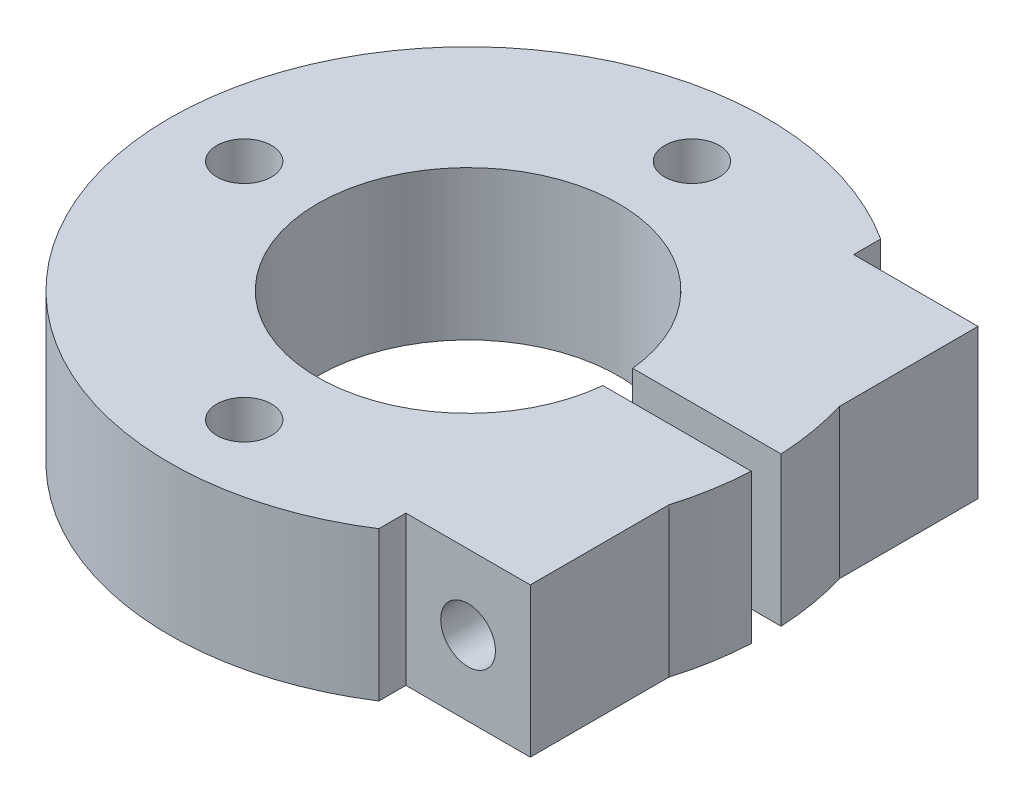
ISO-10303-21;
HEADER;
FILE_DESCRIPTION(('STEP AP214'),'2;1');
FILE_NAME('part.step','',(''),(''),'','','');
FILE_SCHEMA(('AUTOMOTIVE_DESIGN { 1 0 10303 214 1 1 1 1 }'));
ENDSEC;
DATA;
#1=APPLICATION_CONTEXT('core data for automotive mechanical design processes');
#2=APPLICATION_PROTOCOL_DEFINITION('international standard','automotive_design',2000,#1);
#3=PRODUCT_CONTEXT('',#1,'mechanical');
#4=PRODUCT('Part','Part','',(#3));
#5=PRODUCT_RELATED_PRODUCT_CATEGORY('part','',(#4));
#6=PRODUCT_DEFINITION_FORMATION('','',#4);
#7=PRODUCT_DEFINITION_CONTEXT('part definition',#1,'design');
#8=PRODUCT_DEFINITION('design','',#6,#7);
#9=PRODUCT_DEFINITION_SHAPE('','',#8);
#10=(LENGTH_UNIT() NAMED_UNIT(*) SI_UNIT(.MILLI.,.METRE.));
#11=(NAMED_UNIT(*) PLANE_ANGLE_UNIT() SI_UNIT($,.RADIAN.));
#12=(NAMED_UNIT(*) SI_UNIT($,.STERADIAN.) SOLID_ANGLE_UNIT());
#13=UNCERTAINTY_MEASURE_WITH_UNIT(LENGTH_MEASURE(1.E-05),#10,'distance_accuracy_value','');
#14=(GEOMETRIC_REPRESENTATION_CONTEXT(3) GLOBAL_UNCERTAINTY_ASSIGNED_CONTEXT((#13)) GLOBAL_UNIT_ASSIGNED_CONTEXT((#10,
#11,#12)) REPRESENTATION_CONTEXT('',''));
#15=CARTESIAN_POINT('',(0.,0.,0.));
#16=DIRECTION('',(0.,0.,1.));
#17=DIRECTION('',(1.,0.,0.));
#18=AXIS2_PLACEMENT_3D('',#15,#16,#17);
#19=CARTESIAN_POINT('',(-56.2916512459897,-161.,0.));
#20=DIRECTION('',(0.,-1.,0.));
#21=DIRECTION('',(0.,0.,-1.));
#22=AXIS2_PLACEMENT_3D('',#19,#20,#21);
#23=PLANE('',#22);
#24=CARTESIAN_POINT('',(-65.2916512459885,-161.,0.));
#25=DIRECTION('',(0.,-1.,0.));
#26=DIRECTION('',(0.,0.,-1.));
#27=AXIS2_PLACEMENT_3D('',#24,#25,#26);
#28=CIRCLE('',#27,1.1);
#29=CARTESIAN_POINT('',(-65.2916512459885,-161.,-1.1));
#30=VERTEX_POINT('',#29);
#31=EDGE_CURVE('E196',#30,#30,#28,.T.);
#32=ORIENTED_EDGE('',*,*,#31,.F.);
#33=EDGE_LOOP('',(#32));
#34=FACE_BOUND('',#33,.T.);
#35=CARTESIAN_POINT('',(-65.2916512459885,-161.,0.));
#36=DIRECTION('',(0.,-1.,0.));
#37=DIRECTION('',(0.,0.,-1.));
#38=AXIS2_PLACEMENT_3D('',#35,#36,#37);
#39=CIRCLE('',#38,2.);
#40=CARTESIAN_POINT('',(-65.2916512459885,-161.,-2.));
#41=VERTEX_POINT('',#40);
#42=EDGE_CURVE('E156',#41,#41,#39,.T.);
#43=ORIENTED_EDGE('',*,*,#42,.T.);
#44=EDGE_LOOP('',(#43));
#45=FACE_BOUND('',#44,.T.);
#46=ADVANCED_FACE('F41',(#34,#45),#23,.T.);
#47=CARTESIAN_POINT('',(-56.2916512459885,-161.,-9.));
#48=DIRECTION('',(0.,-1.,0.));
#49=DIRECTION('',(0.,0.,-1.));
#50=AXIS2_PLACEMENT_3D('',#47,#48,#49);
#51=CIRCLE('',#50,1.1);
#52=CARTESIAN_POINT('',(-56.2916512459885,-161.,-10.1));
#53=VERTEX_POINT('',#52);
#54=EDGE_CURVE('E195',#53,#53,#51,.T.);
#55=ORIENTED_EDGE('',*,*,#54,.F.);
#56=EDGE_LOOP('',(#55));
#57=FACE_BOUND('',#56,.T.);
#58=CARTESIAN_POINT('',(-56.2916512459885,-161.,-9.));
#59=DIRECTION('',(0.,-1.,0.));
#60=DIRECTION('',(0.,0.,-1.));
#61=AXIS2_PLACEMENT_3D('',#58,#59,#60);
#62=CIRCLE('',#61,2.);
#63=CARTESIAN_POINT('',(-56.2916512459885,-161.,-11.));
#64=VERTEX_POINT('',#63);
#65=EDGE_CURVE('E335',#64,#64,#62,.T.);
#66=ORIENTED_EDGE('',*,*,#65,.T.);
#67=EDGE_LOOP('',(#66));
#68=FACE_BOUND('',#67,.T.);
#69=ADVANCED_FACE('F301',(#57,#68),#23,.T.);
#70=CARTESIAN_POINT('',(-56.2916512459885,-161.,9.));
#71=DIRECTION('',(0.,-1.,0.));
#72=DIRECTION('',(0.,0.,-1.));
#73=AXIS2_PLACEMENT_3D('',#70,#71,#72);
#74=CIRCLE('',#73,1.1);
#75=CARTESIAN_POINT('',(-56.2916512459885,-161.,7.9));
#76=VERTEX_POINT('',#75);
#77=EDGE_CURVE('E186',#76,#76,#74,.T.);
#78=ORIENTED_EDGE('',*,*,#77,.F.);
#79=EDGE_LOOP('',(#78));
#80=FACE_BOUND('',#79,.T.);
#81=CARTESIAN_POINT('',(-56.2916512459885,-161.,9.));
#82=DIRECTION('',(0.,-1.,0.));
#83=DIRECTION('',(0.,0.,-1.));
#84=AXIS2_PLACEMENT_3D('',#81,#82,#83);
#85=CIRCLE('',#84,2.);
#86=CARTESIAN_POINT('',(-56.2916512459885,-161.,7.));
#87=VERTEX_POINT('',#86);
#88=EDGE_CURVE('E326',#87,#87,#85,.T.);
#89=ORIENTED_EDGE('',*,*,#88,.T.);
#90=EDGE_LOOP('',(#89));
#91=FACE_BOUND('',#90,.T.);
#92=ADVANCED_FACE('F306',(#80,#91),#23,.T.);
#93=CARTESIAN_POINT('',(-56.2916512459897,-157.,0.));
#94=DIRECTION('',(0.,-1.,0.));
#95=DIRECTION('',(0.,0.,-1.));
#96=AXIS2_PLACEMENT_3D('',#93,#94,#95);
#97=PLANE('',#96);
#98=CARTESIAN_POINT('',(-56.2916512459897,-157.,0.));
#99=DIRECTION('',(0.,-1.,0.));
#100=DIRECTION('',(0.,0.,-1.));
#101=AXIS2_PLACEMENT_3D('',#98,#99,#100);
#102=CIRCLE('',#101,12.0000000000012);
#103=CARTESIAN_POINT('',(-44.3066606327256,-157.,0.599999999999992));
#104=VERTEX_POINT('',#103);
#105=CARTESIAN_POINT('',(-44.7916512459885,-157.,3.42782730020053));
#106=VERTEX_POINT('',#105);
#107=EDGE_CURVE('E137',#104,#106,#102,.T.);
#108=ORIENTED_EDGE('',*,*,#107,.F.);
#109=DIRECTION('',(1.,0.,0.));
#110=VECTOR('',#109,1.);
#111=CARTESIAN_POINT('',(-44.3066606327256,-157.,0.599999999999992));
#112=LINE('',#111,#110);
#113=CARTESIAN_POINT('',(-50.2714768299105,-157.,0.599999999999976));
#114=VERTEX_POINT('',#113);
#115=EDGE_CURVE('E60',#114,#104,#112,.T.);
#116=ORIENTED_EDGE('',*,*,#115,.F.);
#117=CARTESIAN_POINT('',(-56.2916512459897,-157.,0.));
#118=DIRECTION('',(0.,1.,0.));
#119=DIRECTION('',(0.,0.,-1.));
#120=AXIS2_PLACEMENT_3D('',#117,#118,#119);
#121=CIRCLE('',#120,6.05000000000116);
#122=CARTESIAN_POINT('',(-50.2714768299106,-157.,-0.600000000000006));
#123=VERTEX_POINT('',#122);
#124=EDGE_CURVE('E65',#123,#114,#121,.T.);
#125=ORIENTED_EDGE('',*,*,#124,.F.);
#126=DIRECTION('',(-1.,0.,0.));
#127=VECTOR('',#126,1.);
#128=CARTESIAN_POINT('',(-44.3066606327256,-157.,-0.6));
#129=LINE('',#128,#127);
#130=CARTESIAN_POINT('',(-44.3066606327256,-157.,-0.6));
#131=VERTEX_POINT('',#130);
#132=EDGE_CURVE('E219',#131,#123,#129,.T.);
#133=ORIENTED_EDGE('',*,*,#132,.F.);
#134=CARTESIAN_POINT('',(-56.2916512459897,-157.,0.));
#135=DIRECTION('',(0.,-1.,0.));
#136=DIRECTION('',(0.,0.,-1.));
#137=AXIS2_PLACEMENT_3D('',#134,#135,#136);
#138=CIRCLE('',#137,12.0000000000012);
#139=CARTESIAN_POINT('',(-44.7916512459885,-157.,-3.42782730020053));
#140=VERTEX_POINT('',#139);
#141=EDGE_CURVE('E217',#140,#131,#138,.T.);
#142=ORIENTED_EDGE('',*,*,#141,.F.);
#143=DIRECTION('',(0.,0.,1.));
#144=VECTOR('',#143,1.);
#145=CARTESIAN_POINT('',(-44.7916512459885,-157.,-9.));
#146=LINE('',#145,#144);
#147=CARTESIAN_POINT('',(-44.7916512459885,-157.,-9.));
#148=VERTEX_POINT('',#147);
#149=EDGE_CURVE('E216',#148,#140,#146,.T.);
#150=ORIENTED_EDGE('',*,*,#149,.F.);
#151=DIRECTION('',(1.,0.,0.));
#152=VECTOR('',#151,1.);
#153=CARTESIAN_POINT('',(-44.7916512459885,-157.,-9.));
#154=LINE('',#153,#152);
#155=CARTESIAN_POINT('',(-49.7916512459885,-157.,-9.));
#156=VERTEX_POINT('',#155);
#157=EDGE_CURVE('E212',#156,#148,#154,.T.);
#158=ORIENTED_EDGE('',*,*,#157,.F.);
#159=DIRECTION('',(0.,0.,1.));
#160=VECTOR('',#159,1.);
#161=CARTESIAN_POINT('',(-49.7916512459885,-157.,-10.087120500916));
#162=LINE('',#161,#160);
#163=CARTESIAN_POINT('',(-49.7916512459885,-157.,-10.087120500916));
#164=VERTEX_POINT('',#163);
#165=EDGE_CURVE('E215',#164,#156,#162,.T.);
#166=ORIENTED_EDGE('',*,*,#165,.F.);
#167=CARTESIAN_POINT('',(-56.2916512459897,-157.,0.));
#168=DIRECTION('',(0.,-1.,0.));
#169=DIRECTION('',(0.,0.,-1.));
#170=AXIS2_PLACEMENT_3D('',#167,#168,#169);
#171=CIRCLE('',#170,12.0000000000006);
#172=CARTESIAN_POINT('',(-49.7916512459885,-157.,10.087120500916));
#173=VERTEX_POINT('',#172);
#174=EDGE_CURVE('E209',#173,#164,#171,.T.);
#175=ORIENTED_EDGE('',*,*,#174,.F.);
#176=DIRECTION('',(0.,0.,1.));
#177=VECTOR('',#176,1.);
#178=CARTESIAN_POINT('',(-49.7916512459885,-157.,9.));
#179=LINE('',#178,#177);
#180=CARTESIAN_POINT('',(-49.7916512459885,-157.,9.));
#181=VERTEX_POINT('',#180);
#182=EDGE_CURVE('E208',#181,#173,#179,.T.);
#183=ORIENTED_EDGE('',*,*,#182,.F.);
#184=DIRECTION('',(-1.,0.,0.));
#185=VECTOR('',#184,1.);
#186=CARTESIAN_POINT('',(-44.7916512459885,-157.,9.));
#187=LINE('',#186,#185);
#188=CARTESIAN_POINT('',(-44.7916512459885,-157.,9.));
#189=VERTEX_POINT('',#188);
#190=EDGE_CURVE('E206',#189,#181,#187,.T.);
#191=ORIENTED_EDGE('',*,*,#190,.F.);
#192=DIRECTION('',(0.,0.,1.));
#193=VECTOR('',#192,1.);
#194=CARTESIAN_POINT('',(-44.7916512459885,-157.,3.42782730020053));
#195=LINE('',#194,#193);
#196=EDGE_CURVE('E204',#106,#189,#195,.T.);
#197=ORIENTED_EDGE('',*,*,#196,.F.);
#198=EDGE_LOOP('',(#108,#116,#125,#133,#142,#150,#158,#166,#175,#183,#191,#197));
#199=FACE_BOUND('',#198,.T.);
#200=CARTESIAN_POINT('',(-65.2916512459885,-157.,0.));
#201=DIRECTION('',(0.,-1.,0.));
#202=DIRECTION('',(0.,0.,-1.));
#203=AXIS2_PLACEMENT_3D('',#200,#201,#202);
#204=CIRCLE('',#203,1.1);
#205=CARTESIAN_POINT('',(-65.2916512459885,-157.,-1.1));
#206=VERTEX_POINT('',#205);
#207=EDGE_CURVE('E191',#206,#206,#204,.T.);
#208=ORIENTED_EDGE('',*,*,#207,.T.);
#209=EDGE_LOOP('',(#208));
#210=FACE_BOUND('',#209,.T.);
#211=CARTESIAN_POINT('',(-56.2916512459885,-157.,-9.));
#212=DIRECTION('',(0.,-1.,0.));
#213=DIRECTION('',(0.,0.,-1.));
#214=AXIS2_PLACEMENT_3D('',#211,#212,#213);
#215=CIRCLE('',#214,1.1);
#216=CARTESIAN_POINT('',(-56.2916512459885,-157.,-10.1));
#217=VERTEX_POINT('',#216);
#218=EDGE_CURVE('E188',#217,#217,#215,.T.);
#219=ORIENTED_EDGE('',*,*,#218,.T.);
#220=EDGE_LOOP('',(#219));
#221=FACE_BOUND('',#220,.T.);
#222=CARTESIAN_POINT('',(-56.2916512459885,-157.,9.));
#223=DIRECTION('',(0.,-1.,0.));
#224=DIRECTION('',(0.,0.,-1.));
#225=AXIS2_PLACEMENT_3D('',#222,#223,#224);
#226=CIRCLE('',#225,1.1);
#227=CARTESIAN_POINT('',(-56.2916512459885,-157.,7.9));
#228=VERTEX_POINT('',#227);
#229=EDGE_CURVE('E183',#228,#228,#226,.T.);
#230=ORIENTED_EDGE('',*,*,#229,.T.);
#231=EDGE_LOOP('',(#230));
#232=FACE_BOUND('',#231,.T.);
#233=ADVANCED_FACE('F258',(#199,#210,#221,#232),#97,.F.);
#234=CARTESIAN_POINT('',(-56.2916512459897,-161.,0.));
#235=DIRECTION('',(0.,1.,0.));
#236=DIRECTION('',(0.,0.,1.));
#237=AXIS2_PLACEMENT_3D('',#234,#235,#236);
#238=CYLINDRICAL_SURFACE('',#237,12.0000000000012);
#239=ORIENTED_EDGE('',*,*,#107,.T.);
#240=DIRECTION('',(0.,1.,0.));
#241=VECTOR('',#240,1.);
#242=CARTESIAN_POINT('',(-44.7916512459885,-161.,3.42782730020053));
#243=LINE('',#242,#241);
#244=CARTESIAN_POINT('',(-44.7916512459885,-163.,3.42782730020053));
#245=VERTEX_POINT('',#244);
#246=EDGE_CURVE('E11',#245,#106,#243,.T.);
#247=ORIENTED_EDGE('',*,*,#246,.F.);
#248=CARTESIAN_POINT('',(-56.2916512459897,-163.,0.));
#249=DIRECTION('',(0.,-1.,0.));
#250=DIRECTION('',(0.,0.,-1.));
#251=AXIS2_PLACEMENT_3D('',#248,#249,#250);
#252=CIRCLE('',#251,12.0000000000012);
#253=CARTESIAN_POINT('',(-44.3066606327256,-163.,0.599999999999992));
#254=VERTEX_POINT('',#253);
#255=EDGE_CURVE('E133',#254,#245,#252,.T.);
#256=ORIENTED_EDGE('',*,*,#255,.F.);
#257=DIRECTION('',(0.,1.,0.));
#258=VECTOR('',#257,1.);
#259=CARTESIAN_POINT('',(-44.3066606327256,-161.,0.599999999999992));
#260=LINE('',#259,#258);
#261=EDGE_CURVE('E221',#254,#104,#260,.T.);
#262=ORIENTED_EDGE('',*,*,#261,.T.);
#263=EDGE_LOOP('',(#239,#247,#256,#262));
#264=FACE_BOUND('',#263,.T.);
#265=ADVANCED_FACE('F43',(#264),#238,.T.);
#266=CARTESIAN_POINT('',(-44.7916512459885,-161.,3.42782730020053));
#267=DIRECTION('',(-1.,0.,0.));
#268=DIRECTION('',(0.,0.,1.));
#269=AXIS2_PLACEMENT_3D('',#266,#267,#268);
#270=PLANE('',#269);
#271=ORIENTED_EDGE('',*,*,#196,.T.);
#272=DIRECTION('',(0.,1.,0.));
#273=VECTOR('',#272,1.);
#274=CARTESIAN_POINT('',(-44.7916512459885,-161.,9.));
#275=LINE('',#274,#273);
#276=CARTESIAN_POINT('',(-44.7916512459885,-163.,9.));
#277=VERTEX_POINT('',#276);
#278=EDGE_CURVE('E49',#277,#189,#275,.T.);
#279=ORIENTED_EDGE('',*,*,#278,.F.);
#280=DIRECTION('',(0.,0.,1.));
#281=VECTOR('',#280,1.);
#282=CARTESIAN_POINT('',(-44.7916512459885,-163.,3.42782730020053));
#283=LINE('',#282,#281);
#284=EDGE_CURVE('E139',#245,#277,#283,.T.);
#285=ORIENTED_EDGE('',*,*,#284,.F.);
#286=ORIENTED_EDGE('',*,*,#246,.T.);
#287=EDGE_LOOP('',(#271,#279,#285,#286));
#288=FACE_BOUND('',#287,.T.);
#289=ADVANCED_FACE('F136',(#288),#270,.F.);
#290=CARTESIAN_POINT('',(-44.7916512459885,-161.,9.));
#291=DIRECTION('',(0.,0.,-1.));
#292=DIRECTION('',(-1.,0.,0.));
#293=AXIS2_PLACEMENT_3D('',#290,#291,#292);
#294=PLANE('',#293);
#295=CARTESIAN_POINT('',(-47.2916512459885,-160.,9.));
#296=DIRECTION('',(0.,0.,-1.));
#297=DIRECTION('',(-1.,0.,0.));
#298=AXIS2_PLACEMENT_3D('',#295,#296,#297);
#299=CIRCLE('',#298,1.1);
#300=CARTESIAN_POINT('',(-48.3916512459885,-160.,9.));
#301=VERTEX_POINT('',#300);
#302=EDGE_CURVE('E328',#301,#301,#299,.F.);
#303=ORIENTED_EDGE('',*,*,#302,.F.);
#304=EDGE_LOOP('',(#303));
#305=FACE_BOUND('',#304,.T.);
#306=ORIENTED_EDGE('',*,*,#190,.T.);
#307=DIRECTION('',(0.,1.,0.));
#308=VECTOR('',#307,1.);
#309=CARTESIAN_POINT('',(-49.7916512459885,-161.,9.));
#310=LINE('',#309,#308);
#311=CARTESIAN_POINT('',(-49.7916512459885,-163.,9.));
#312=VERTEX_POINT('',#311);
#313=EDGE_CURVE('E248',#312,#181,#310,.T.);
#314=ORIENTED_EDGE('',*,*,#313,.F.);
#315=DIRECTION('',(-1.,0.,0.));
#316=VECTOR('',#315,1.);
#317=CARTESIAN_POINT('',(-44.7916512459885,-163.,9.));
#318=LINE('',#317,#316);
#319=EDGE_CURVE('E144',#277,#312,#318,.T.);
#320=ORIENTED_EDGE('',*,*,#319,.F.);
#321=ORIENTED_EDGE('',*,*,#278,.T.);
#322=EDGE_LOOP('',(#306,#314,#320,#321));
#323=FACE_BOUND('',#322,.T.);
#324=ADVANCED_FACE('F251',(#305,#323),#294,.F.);
#325=CARTESIAN_POINT('',(-49.7916512459885,-161.,9.));
#326=DIRECTION('',(-1.,0.,0.));
#327=DIRECTION('',(0.,0.,1.));
#328=AXIS2_PLACEMENT_3D('',#325,#326,#327);
#329=PLANE('',#328);
#330=ORIENTED_EDGE('',*,*,#182,.T.);
#331=DIRECTION('',(0.,1.,0.));
#332=VECTOR('',#331,1.);
#333=CARTESIAN_POINT('',(-49.7916512459885,-161.,10.087120500916));
#334=LINE('',#333,#332);
#335=CARTESIAN_POINT('',(-49.7916512459885,-163.,10.087120500916));
#336=VERTEX_POINT('',#335);
#337=EDGE_CURVE('E245',#336,#173,#334,.T.);
#338=ORIENTED_EDGE('',*,*,#337,.F.);
#339=DIRECTION('',(0.,0.,1.));
#340=VECTOR('',#339,1.);
#341=CARTESIAN_POINT('',(-49.7916512459885,-163.,9.));
#342=LINE('',#341,#340);
#343=EDGE_CURVE('E161',#312,#336,#342,.T.);
#344=ORIENTED_EDGE('',*,*,#343,.F.);
#345=ORIENTED_EDGE('',*,*,#313,.T.);
#346=EDGE_LOOP('',(#330,#338,#344,#345));
#347=FACE_BOUND('',#346,.T.);
#348=ADVANCED_FACE('F261',(#347),#329,.F.);
#349=CARTESIAN_POINT('',(-56.2916512459897,-161.,0.));
#350=DIRECTION('',(0.,1.,0.));
#351=DIRECTION('',(0.,0.,1.));
#352=AXIS2_PLACEMENT_3D('',#349,#350,#351);
#353=CYLINDRICAL_SURFACE('',#352,12.0000000000006);
#354=ORIENTED_EDGE('',*,*,#174,.T.);
#355=DIRECTION('',(0.,1.,0.));
#356=VECTOR('',#355,1.);
#357=CARTESIAN_POINT('',(-49.7916512459885,-161.,-10.087120500916));
#358=LINE('',#357,#356);
#359=CARTESIAN_POINT('',(-49.7916512459885,-163.,-10.087120500916));
#360=VERTEX_POINT('',#359);
#361=EDGE_CURVE('E242',#360,#164,#358,.T.);
#362=ORIENTED_EDGE('',*,*,#361,.F.);
#363=CARTESIAN_POINT('',(-56.2916512459897,-163.,0.));
#364=DIRECTION('',(0.,-1.,0.));
#365=DIRECTION('',(0.,0.,-1.));
#366=AXIS2_PLACEMENT_3D('',#363,#364,#365);
#367=CIRCLE('',#366,12.0000000000006);
#368=EDGE_CURVE('E163',#336,#360,#367,.T.);
#369=ORIENTED_EDGE('',*,*,#368,.F.);
#370=ORIENTED_EDGE('',*,*,#337,.T.);
#371=EDGE_LOOP('',(#354,#362,#369,#370));
#372=FACE_BOUND('',#371,.T.);
#373=ADVANCED_FACE('F264',(#372),#353,.T.);
#374=CARTESIAN_POINT('',(-49.7916512459885,-161.,-10.087120500916));
#375=DIRECTION('',(-1.,0.,0.));
#376=DIRECTION('',(0.,0.,1.));
#377=AXIS2_PLACEMENT_3D('',#374,#375,#376);
#378=PLANE('',#377);
#379=ORIENTED_EDGE('',*,*,#165,.T.);
#380=DIRECTION('',(0.,1.,0.));
#381=VECTOR('',#380,1.);
#382=CARTESIAN_POINT('',(-49.7916512459885,-161.,-9.));
#383=LINE('',#382,#381);
#384=CARTESIAN_POINT('',(-49.7916512459885,-163.,-9.));
#385=VERTEX_POINT('',#384);
#386=EDGE_CURVE('E239',#385,#156,#383,.T.);
#387=ORIENTED_EDGE('',*,*,#386,.F.);
#388=DIRECTION('',(0.,0.,1.));
#389=VECTOR('',#388,1.);
#390=CARTESIAN_POINT('',(-49.7916512459885,-163.,-10.087120500916));
#391=LINE('',#390,#389);
#392=EDGE_CURVE('E170',#360,#385,#391,.T.);
#393=ORIENTED_EDGE('',*,*,#392,.F.);
#394=ORIENTED_EDGE('',*,*,#361,.T.);
#395=EDGE_LOOP('',(#379,#387,#393,#394));
#396=FACE_BOUND('',#395,.T.);
#397=ADVANCED_FACE('F267',(#396),#378,.F.);
#398=CARTESIAN_POINT('',(-44.7916512459885,-161.,-9.));
#399=DIRECTION('',(0.,0.,1.));
#400=DIRECTION('',(1.,0.,0.));
#401=AXIS2_PLACEMENT_3D('',#398,#399,#400);
#402=PLANE('',#401);
#403=CARTESIAN_POINT('',(-47.2916512459885,-160.,-9.));
#404=DIRECTION('',(0.,0.,1.));
#405=DIRECTION('',(1.,0.,0.));
#406=AXIS2_PLACEMENT_3D('',#403,#404,#405);
#407=CIRCLE('',#406,1.1);
#408=CARTESIAN_POINT('',(-46.1916512459885,-160.,-9.));
#409=VERTEX_POINT('',#408);
#410=EDGE_CURVE('E333',#409,#409,#407,.F.);
#411=ORIENTED_EDGE('',*,*,#410,.F.);
#412=EDGE_LOOP('',(#411));
#413=FACE_BOUND('',#412,.T.);
#414=ORIENTED_EDGE('',*,*,#157,.T.);
#415=DIRECTION('',(0.,1.,0.));
#416=VECTOR('',#415,1.);
#417=CARTESIAN_POINT('',(-44.7916512459885,-161.,-9.));
#418=LINE('',#417,#416);
#419=CARTESIAN_POINT('',(-44.7916512459885,-163.,-9.));
#420=VERTEX_POINT('',#419);
#421=EDGE_CURVE('E237',#420,#148,#418,.T.);
#422=ORIENTED_EDGE('',*,*,#421,.F.);
#423=DIRECTION('',(1.,0.,0.));
#424=VECTOR('',#423,1.);
#425=CARTESIAN_POINT('',(-44.7916512459885,-163.,-9.));
#426=LINE('',#425,#424);
#427=EDGE_CURVE('E168',#385,#420,#426,.T.);
#428=ORIENTED_EDGE('',*,*,#427,.F.);
#429=ORIENTED_EDGE('',*,*,#386,.T.);
#430=EDGE_LOOP('',(#414,#422,#428,#429));
#431=FACE_BOUND('',#430,.T.);
#432=ADVANCED_FACE('F275',(#413,#431),#402,.F.);
#433=CARTESIAN_POINT('',(-44.7916512459885,-161.,-9.));
#434=DIRECTION('',(-1.,0.,0.));
#435=DIRECTION('',(0.,0.,1.));
#436=AXIS2_PLACEMENT_3D('',#433,#434,#435);
#437=PLANE('',#436);
#438=ORIENTED_EDGE('',*,*,#149,.T.);
#439=DIRECTION('',(0.,1.,0.));
#440=VECTOR('',#439,1.);
#441=CARTESIAN_POINT('',(-44.7916512459885,-161.,-3.42782730020053));
#442=LINE('',#441,#440);
#443=CARTESIAN_POINT('',(-44.7916512459885,-163.,-3.42782730020053));
#444=VERTEX_POINT('',#443);
#445=EDGE_CURVE('E233',#444,#140,#442,.T.);
#446=ORIENTED_EDGE('',*,*,#445,.F.);
#447=DIRECTION('',(0.,0.,1.));
#448=VECTOR('',#447,1.);
#449=CARTESIAN_POINT('',(-44.7916512459885,-163.,-9.));
#450=LINE('',#449,#448);
#451=EDGE_CURVE('E174',#420,#444,#450,.T.);
#452=ORIENTED_EDGE('',*,*,#451,.F.);
#453=ORIENTED_EDGE('',*,*,#421,.T.);
#454=EDGE_LOOP('',(#438,#446,#452,#453));
#455=FACE_BOUND('',#454,.T.);
#456=ADVANCED_FACE('F280',(#455),#437,.F.);
#457=CARTESIAN_POINT('',(-56.2916512459897,-161.,0.));
#458=DIRECTION('',(0.,1.,0.));
#459=DIRECTION('',(0.,0.,1.));
#460=AXIS2_PLACEMENT_3D('',#457,#458,#459);
#461=CYLINDRICAL_SURFACE('',#460,12.0000000000012);
#462=ORIENTED_EDGE('',*,*,#141,.T.);
#463=DIRECTION('',(0.,1.,0.));
#464=VECTOR('',#463,1.);
#465=CARTESIAN_POINT('',(-44.3066606327256,-161.,-0.6));
#466=LINE('',#465,#464);
#467=CARTESIAN_POINT('',(-44.3066606327256,-163.,-0.6));
#468=VERTEX_POINT('',#467);
#469=EDGE_CURVE('E230',#468,#131,#466,.T.);
#470=ORIENTED_EDGE('',*,*,#469,.F.);
#471=CARTESIAN_POINT('',(-56.2916512459897,-163.,0.));
#472=DIRECTION('',(0.,-1.,0.));
#473=DIRECTION('',(0.,0.,-1.));
#474=AXIS2_PLACEMENT_3D('',#471,#472,#473);
#475=CIRCLE('',#474,12.0000000000012);
#476=EDGE_CURVE('E177',#444,#468,#475,.T.);
#477=ORIENTED_EDGE('',*,*,#476,.F.);
#478=ORIENTED_EDGE('',*,*,#445,.T.);
#479=EDGE_LOOP('',(#462,#470,#477,#478));
#480=FACE_BOUND('',#479,.T.);
#481=ADVANCED_FACE('F281',(#480),#461,.T.);
#482=CARTESIAN_POINT('',(-44.3066606327256,-161.,-0.6));
#483=DIRECTION('',(0.,0.,-1.));
#484=DIRECTION('',(-1.,0.,0.));
#485=AXIS2_PLACEMENT_3D('',#482,#483,#484);
#486=PLANE('',#485);
#487=CARTESIAN_POINT('',(-47.2916512459885,-160.,-0.6));
#488=DIRECTION('',(0.,0.,-1.));
#489=DIRECTION('',(-1.,0.,0.));
#490=AXIS2_PLACEMENT_3D('',#487,#488,#489);
#491=CIRCLE('',#490,1.1);
#492=CARTESIAN_POINT('',(-48.3916512459885,-160.,-0.6));
#493=VERTEX_POINT('',#492);
#494=EDGE_CURVE('E559',#493,#493,#491,.F.);
#495=ORIENTED_EDGE('',*,*,#494,.F.);
#496=EDGE_LOOP('',(#495));
#497=FACE_BOUND('',#496,.T.);
#498=ORIENTED_EDGE('',*,*,#132,.T.);
#499=DIRECTION('',(0.,1.,0.));
#500=VECTOR('',#499,1.);
#501=CARTESIAN_POINT('',(-50.2714768299106,-161.,-0.600000000000006));
#502=LINE('',#501,#500);
#503=CARTESIAN_POINT('',(-50.2714768299106,-163.,-0.600000000000006));
#504=VERTEX_POINT('',#503);
#505=EDGE_CURVE('E229',#504,#123,#502,.T.);
#506=ORIENTED_EDGE('',*,*,#505,.F.);
#507=DIRECTION('',(-1.,0.,0.));
#508=VECTOR('',#507,1.);
#509=CARTESIAN_POINT('',(-44.3066606327256,-163.,-0.6));
#510=LINE('',#509,#508);
#511=EDGE_CURVE('E179',#468,#504,#510,.T.);
#512=ORIENTED_EDGE('',*,*,#511,.F.);
#513=ORIENTED_EDGE('',*,*,#469,.T.);
#514=EDGE_LOOP('',(#498,#506,#512,#513));
#515=FACE_BOUND('',#514,.T.);
#516=ADVANCED_FACE('F285',(#497,#515),#486,.F.);
#517=CARTESIAN_POINT('',(-56.2916512459897,-161.,0.));
#518=DIRECTION('',(0.,1.,0.));
#519=DIRECTION('',(0.,0.,1.));
#520=AXIS2_PLACEMENT_3D('',#517,#518,#519);
#521=CYLINDRICAL_SURFACE('',#520,6.05000000000116);
#522=ORIENTED_EDGE('',*,*,#124,.T.);
#523=DIRECTION('',(0.,1.,0.));
#524=VECTOR('',#523,1.);
#525=CARTESIAN_POINT('',(-50.2714768299105,-161.,0.599999999999976));
#526=LINE('',#525,#524);
#527=CARTESIAN_POINT('',(-50.2714768299105,-163.,0.599999999999976));
#528=VERTEX_POINT('',#527);
#529=EDGE_CURVE('E226',#528,#114,#526,.T.);
#530=ORIENTED_EDGE('',*,*,#529,.F.);
#531=CARTESIAN_POINT('',(-56.2916512459897,-163.,0.));
#532=DIRECTION('',(0.,1.,0.));
#533=DIRECTION('',(0.,0.,-1.));
#534=AXIS2_PLACEMENT_3D('',#531,#532,#533);
#535=CIRCLE('',#534,6.05000000000116);
#536=EDGE_CURVE('E185',#504,#528,#535,.T.);
#537=ORIENTED_EDGE('',*,*,#536,.F.);
#538=ORIENTED_EDGE('',*,*,#505,.T.);
#539=EDGE_LOOP('',(#522,#530,#537,#538));
#540=FACE_BOUND('',#539,.T.);
#541=ADVANCED_FACE('F287',(#540),#521,.F.);
#542=CARTESIAN_POINT('',(-44.3066606327256,-161.,0.599999999999992));
#543=DIRECTION('',(0.,0.,1.));
#544=DIRECTION('',(1.,0.,0.));
#545=AXIS2_PLACEMENT_3D('',#542,#543,#544);
#546=PLANE('',#545);
#547=CARTESIAN_POINT('',(-47.2916512459885,-160.,0.599999999999983));
#548=DIRECTION('',(0.,0.,1.));
#549=DIRECTION('',(1.,0.,0.));
#550=AXIS2_PLACEMENT_3D('',#547,#548,#549);
#551=CIRCLE('',#550,1.1);
#552=CARTESIAN_POINT('',(-46.1916512459885,-160.,0.599999999999985));
#553=VERTEX_POINT('',#552);
#554=EDGE_CURVE('E44',#553,#553,#551,.F.);
#555=ORIENTED_EDGE('',*,*,#554,.F.);
#556=EDGE_LOOP('',(#555));
#557=FACE_BOUND('',#556,.T.);
#558=ORIENTED_EDGE('',*,*,#115,.T.);
#559=ORIENTED_EDGE('',*,*,#261,.F.);
#560=DIRECTION('',(1.,0.,0.));
#561=VECTOR('',#560,1.);
#562=CARTESIAN_POINT('',(-44.3066606327256,-163.,0.599999999999992));
#563=LINE('',#562,#561);
#564=EDGE_CURVE('E155',#528,#254,#563,.T.);
#565=ORIENTED_EDGE('',*,*,#564,.F.);
#566=ORIENTED_EDGE('',*,*,#529,.T.);
#567=EDGE_LOOP('',(#558,#559,#565,#566));
#568=FACE_BOUND('',#567,.T.);
#569=ADVANCED_FACE('F290',(#557,#568),#546,.F.);
#570=CARTESIAN_POINT('',(-65.2916512459885,-161.,0.));
#571=DIRECTION('',(0.,1.,0.));
#572=DIRECTION('',(0.,0.,1.));
#573=AXIS2_PLACEMENT_3D('',#570,#571,#572);
#574=CYLINDRICAL_SURFACE('',#573,1.1);
#575=ORIENTED_EDGE('',*,*,#31,.T.);
#576=EDGE_LOOP('',(#575));
#577=FACE_BOUND('',#576,.T.);
#578=ORIENTED_EDGE('',*,*,#207,.F.);
#579=EDGE_LOOP('',(#578));
#580=FACE_BOUND('',#579,.T.);
#581=ADVANCED_FACE('F289',(#577,#580),#574,.F.);
#582=CARTESIAN_POINT('',(-56.2916512459885,-161.,-9.));
#583=DIRECTION('',(0.,1.,0.));
#584=DIRECTION('',(0.,0.,1.));
#585=AXIS2_PLACEMENT_3D('',#582,#583,#584);
#586=CYLINDRICAL_SURFACE('',#585,1.1);
#587=ORIENTED_EDGE('',*,*,#54,.T.);
#588=EDGE_LOOP('',(#587));
#589=FACE_BOUND('',#588,.T.);
#590=ORIENTED_EDGE('',*,*,#218,.F.);
#591=EDGE_LOOP('',(#590));
#592=FACE_BOUND('',#591,.T.);
#593=ADVANCED_FACE('F297',(#589,#592),#586,.F.);
#594=CARTESIAN_POINT('',(-56.2916512459885,-161.,9.));
#595=DIRECTION('',(0.,1.,0.));
#596=DIRECTION('',(0.,0.,1.));
#597=AXIS2_PLACEMENT_3D('',#594,#595,#596);
#598=CYLINDRICAL_SURFACE('',#597,1.1);
#599=ORIENTED_EDGE('',*,*,#77,.T.);
#600=EDGE_LOOP('',(#599));
#601=FACE_BOUND('',#600,.T.);
#602=ORIENTED_EDGE('',*,*,#229,.F.);
#603=EDGE_LOOP('',(#602));
#604=FACE_BOUND('',#603,.T.);
#605=ADVANCED_FACE('F365',(#601,#604),#598,.F.);
#606=CARTESIAN_POINT('',(-56.2916512459897,-163.,0.));
#607=DIRECTION('',(0.,-1.,0.));
#608=DIRECTION('',(0.,0.,-1.));
#609=AXIS2_PLACEMENT_3D('',#606,#607,#608);
#610=PLANE('',#609);
#611=CARTESIAN_POINT('',(-56.2916512459885,-163.,-9.));
#612=DIRECTION('',(0.,-1.,0.));
#613=DIRECTION('',(0.,0.,-1.));
#614=AXIS2_PLACEMENT_3D('',#611,#612,#613);
#615=CIRCLE('',#614,2.);
#616=CARTESIAN_POINT('',(-56.2916512459885,-163.,-11.));
#617=VERTEX_POINT('',#616);
#618=EDGE_CURVE('E339',#617,#617,#615,.T.);
#619=ORIENTED_EDGE('',*,*,#618,.F.);
#620=EDGE_LOOP('',(#619));
#621=FACE_BOUND('',#620,.T.);
#622=ORIENTED_EDGE('',*,*,#255,.T.);
#623=ORIENTED_EDGE('',*,*,#284,.T.);
#624=ORIENTED_EDGE('',*,*,#319,.T.);
#625=ORIENTED_EDGE('',*,*,#343,.T.);
#626=ORIENTED_EDGE('',*,*,#368,.T.);
#627=ORIENTED_EDGE('',*,*,#392,.T.);
#628=ORIENTED_EDGE('',*,*,#427,.T.);
#629=ORIENTED_EDGE('',*,*,#451,.T.);
#630=ORIENTED_EDGE('',*,*,#476,.T.);
#631=ORIENTED_EDGE('',*,*,#511,.T.);
#632=ORIENTED_EDGE('',*,*,#536,.T.);
#633=ORIENTED_EDGE('',*,*,#564,.T.);
#634=EDGE_LOOP('',(#622,#623,#624,#625,#626,#627,#628,#629,#630,#631,#632,#633));
#635=FACE_BOUND('',#634,.T.);
#636=CARTESIAN_POINT('',(-65.2916512459885,-163.,0.));
#637=DIRECTION('',(0.,-1.,0.));
#638=DIRECTION('',(0.,0.,-1.));
#639=AXIS2_PLACEMENT_3D('',#636,#637,#638);
#640=CIRCLE('',#639,2.);
#641=CARTESIAN_POINT('',(-65.2916512459885,-163.,-2.));
#642=VERTEX_POINT('',#641);
#643=EDGE_CURVE('E153',#642,#642,#640,.T.);
#644=ORIENTED_EDGE('',*,*,#643,.F.);
#645=EDGE_LOOP('',(#644));
#646=FACE_BOUND('',#645,.T.);
#647=CARTESIAN_POINT('',(-56.2916512459885,-163.,9.));
#648=DIRECTION('',(0.,-1.,0.));
#649=DIRECTION('',(0.,0.,-1.));
#650=AXIS2_PLACEMENT_3D('',#647,#648,#649);
#651=CIRCLE('',#650,2.);
#652=CARTESIAN_POINT('',(-56.2916512459885,-163.,7.));
#653=VERTEX_POINT('',#652);
#654=EDGE_CURVE('E327',#653,#653,#651,.T.);
#655=ORIENTED_EDGE('',*,*,#654,.F.);
#656=EDGE_LOOP('',(#655));
#657=FACE_BOUND('',#656,.T.);
#658=ADVANCED_FACE('F146',(#621,#635,#646,#657),#610,.T.);
#659=CARTESIAN_POINT('',(-65.2916512459885,-163.,0.));
#660=DIRECTION('',(0.,1.,0.));
#661=DIRECTION('',(0.,0.,1.));
#662=AXIS2_PLACEMENT_3D('',#659,#660,#661);
#663=CYLINDRICAL_SURFACE('',#662,2.);
#664=ORIENTED_EDGE('',*,*,#643,.T.);
#665=EDGE_LOOP('',(#664));
#666=FACE_BOUND('',#665,.T.);
#667=ORIENTED_EDGE('',*,*,#42,.F.);
#668=EDGE_LOOP('',(#667));
#669=FACE_BOUND('',#668,.T.);
#670=ADVANCED_FACE('F346',(#666,#669),#663,.F.);
#671=CARTESIAN_POINT('',(-56.2916512459885,-163.,-9.));
#672=DIRECTION('',(0.,1.,0.));
#673=DIRECTION('',(0.,0.,1.));
#674=AXIS2_PLACEMENT_3D('',#671,#672,#673);
#675=CYLINDRICAL_SURFACE('',#674,2.);
#676=ORIENTED_EDGE('',*,*,#618,.T.);
#677=EDGE_LOOP('',(#676));
#678=FACE_BOUND('',#677,.T.);
#679=ORIENTED_EDGE('',*,*,#65,.F.);
#680=EDGE_LOOP('',(#679));
#681=FACE_BOUND('',#680,.T.);
#682=ADVANCED_FACE('F341',(#678,#681),#675,.F.);
#683=CARTESIAN_POINT('',(-56.2916512459885,-163.,9.));
#684=DIRECTION('',(0.,1.,0.));
#685=DIRECTION('',(0.,0.,1.));
#686=AXIS2_PLACEMENT_3D('',#683,#684,#685);
#687=CYLINDRICAL_SURFACE('',#686,2.);
#688=ORIENTED_EDGE('',*,*,#654,.T.);
#689=EDGE_LOOP('',(#688));
#690=FACE_BOUND('',#689,.T.);
#691=ORIENTED_EDGE('',*,*,#88,.F.);
#692=EDGE_LOOP('',(#691));
#693=FACE_BOUND('',#692,.T.);
#694=ADVANCED_FACE('F350',(#690,#693),#687,.F.);
#695=CARTESIAN_POINT('',(-47.2916512459885,-160.,12.));
#696=DIRECTION('',(0.,0.,-1.));
#697=DIRECTION('',(-1.,0.,0.));
#698=AXIS2_PLACEMENT_3D('',#695,#696,#697);
#699=CYLINDRICAL_SURFACE('',#698,1.1);
#700=ORIENTED_EDGE('',*,*,#554,.T.);
#701=EDGE_LOOP('',(#700));
#702=FACE_BOUND('',#701,.T.);
#703=ORIENTED_EDGE('',*,*,#302,.T.);
#704=EDGE_LOOP('',(#703));
#705=FACE_BOUND('',#704,.T.);
#706=ADVANCED_FACE('F355',(#702,#705),#699,.F.);
#707=ORIENTED_EDGE('',*,*,#494,.T.);
#708=EDGE_LOOP('',(#707));
#709=FACE_BOUND('',#708,.T.);
#710=ORIENTED_EDGE('',*,*,#410,.T.);
#711=EDGE_LOOP('',(#710));
#712=FACE_BOUND('',#711,.T.);
#713=ADVANCED_FACE('F542',(#709,#712),#699,.F.);
#714=CLOSED_SHELL('',(#46,#69,#92,#233,#265,#289,#324,#348,#373,#397,#432,#456,#481,#516,#541,
#569,#581,#593,#605,#658,#670,#682,#694,#706,#713));
#715=MANIFOLD_SOLID_BREP('B2',#714);
#716=ADVANCED_BREP_SHAPE_REPRESENTATION('',(#18,#715),#14);
#717=SHAPE_DEFINITION_REPRESENTATION(#9,#716);
ENDSEC;
END-ISO-10303-21;
